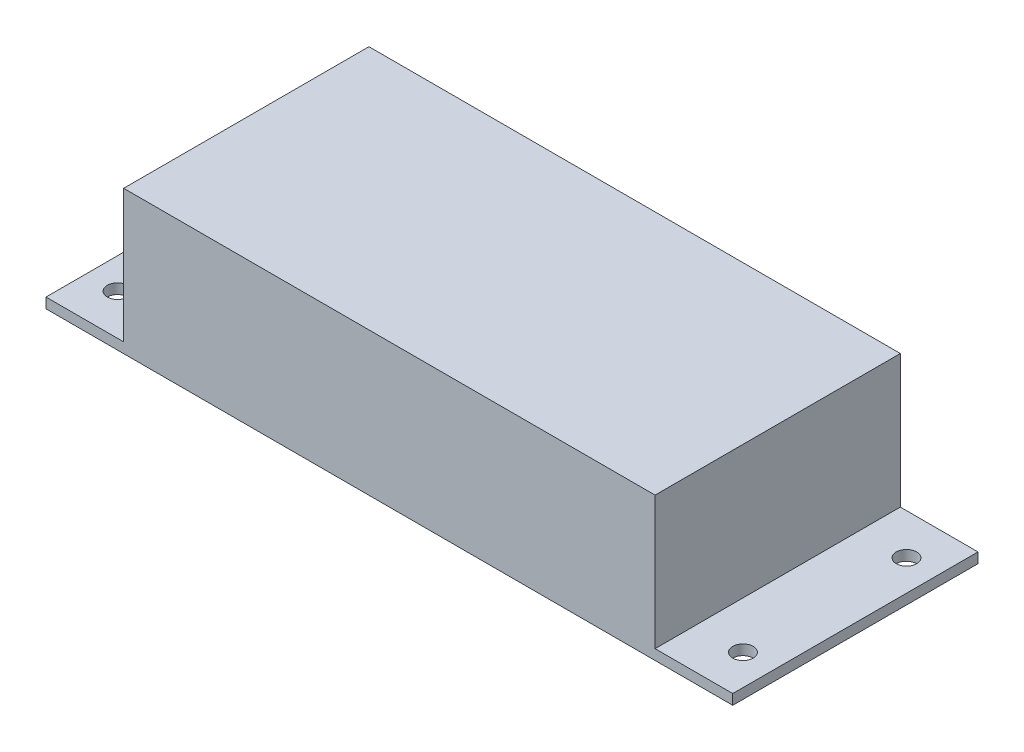
ISO-10303-21;
HEADER;
FILE_DESCRIPTION(('STEP AP214'),'2;1');
FILE_NAME('part.step','',(''),(''),'','','');
FILE_SCHEMA(('AUTOMOTIVE_DESIGN { 1 0 10303 214 1 1 1 1 }'));
ENDSEC;
DATA;
#1=APPLICATION_CONTEXT('core data for automotive mechanical design processes');
#2=APPLICATION_PROTOCOL_DEFINITION('international standard','automotive_design',2000,#1);
#3=PRODUCT_CONTEXT('',#1,'mechanical');
#4=PRODUCT('Part','Part','',(#3));
#5=PRODUCT_RELATED_PRODUCT_CATEGORY('part','',(#4));
#6=PRODUCT_DEFINITION_FORMATION('','',#4);
#7=PRODUCT_DEFINITION_CONTEXT('part definition',#1,'design');
#8=PRODUCT_DEFINITION('design','',#6,#7);
#9=PRODUCT_DEFINITION_SHAPE('','',#8);
#10=(LENGTH_UNIT() NAMED_UNIT(*) SI_UNIT(.MILLI.,.METRE.));
#11=(NAMED_UNIT(*) PLANE_ANGLE_UNIT() SI_UNIT($,.RADIAN.));
#12=(NAMED_UNIT(*) SI_UNIT($,.STERADIAN.) SOLID_ANGLE_UNIT());
#13=UNCERTAINTY_MEASURE_WITH_UNIT(LENGTH_MEASURE(1.E-05),#10,'distance_accuracy_value','');
#14=(GEOMETRIC_REPRESENTATION_CONTEXT(3) GLOBAL_UNCERTAINTY_ASSIGNED_CONTEXT((#13)) GLOBAL_UNIT_ASSIGNED_CONTEXT((#10,
#11,#12)) REPRESENTATION_CONTEXT('',''));
#15=CARTESIAN_POINT('',(0.,0.,0.));
#16=DIRECTION('',(0.,0.,1.));
#17=DIRECTION('',(1.,0.,0.));
#18=AXIS2_PLACEMENT_3D('',#15,#16,#17);
#19=CARTESIAN_POINT('',(41.275,22.2504,19.05));
#20=DIRECTION('',(-1.,0.,0.));
#21=DIRECTION('',(0.,0.,1.));
#22=AXIS2_PLACEMENT_3D('',#19,#20,#21);
#23=PLANE('',#22);
#24=DIRECTION('',(0.,-1.,0.));
#25=VECTOR('',#24,1.);
#26=CARTESIAN_POINT('',(41.275,22.2504,19.05));
#27=LINE('',#26,#25);
#28=CARTESIAN_POINT('',(41.275,22.2504,19.05));
#29=VERTEX_POINT('',#28);
#30=CARTESIAN_POINT('',(41.275,1.5875,19.05));
#31=VERTEX_POINT('',#30);
#32=EDGE_CURVE('E200',#29,#31,#27,.T.);
#33=ORIENTED_EDGE('',*,*,#32,.T.);
#34=DIRECTION('',(0.,0.,-1.));
#35=VECTOR('',#34,1.);
#36=CARTESIAN_POINT('',(41.275,1.5875,19.05));
#37=LINE('',#36,#35);
#38=CARTESIAN_POINT('',(41.275,1.5875,-19.05));
#39=VERTEX_POINT('',#38);
#40=EDGE_CURVE('E162',#31,#39,#37,.T.);
#41=ORIENTED_EDGE('',*,*,#40,.T.);
#42=DIRECTION('',(0.,-1.,0.));
#43=VECTOR('',#42,1.);
#44=CARTESIAN_POINT('',(41.275,22.2504,-19.05));
#45=LINE('',#44,#43);
#46=CARTESIAN_POINT('',(41.275,22.2504,-19.05));
#47=VERTEX_POINT('',#46);
#48=EDGE_CURVE('E12',#47,#39,#45,.T.);
#49=ORIENTED_EDGE('',*,*,#48,.F.);
#50=DIRECTION('',(0.,0.,-1.));
#51=VECTOR('',#50,1.);
#52=CARTESIAN_POINT('',(41.275,22.2504,19.05));
#53=LINE('',#52,#51);
#54=EDGE_CURVE('E191',#29,#47,#53,.T.);
#55=ORIENTED_EDGE('',*,*,#54,.F.);
#56=EDGE_LOOP('',(#33,#41,#49,#55));
#57=FACE_BOUND('',#56,.T.);
#58=ADVANCED_FACE('F93',(#57),#23,.F.);
#59=CARTESIAN_POINT('',(-41.275,22.2504,-19.05));
#60=DIRECTION('',(0.,0.,1.));
#61=DIRECTION('',(1.,0.,0.));
#62=AXIS2_PLACEMENT_3D('',#59,#60,#61);
#63=PLANE('',#62);
#64=ORIENTED_EDGE('',*,*,#48,.T.);
#65=DIRECTION('',(1.,0.,0.));
#66=VECTOR('',#65,1.);
#67=CARTESIAN_POINT('',(-53.34,1.5875,-19.05));
#68=LINE('',#67,#66);
#69=CARTESIAN_POINT('',(53.34,1.5875,-19.05));
#70=VERTEX_POINT('',#69);
#71=EDGE_CURVE('E177',#39,#70,#68,.T.);
#72=ORIENTED_EDGE('',*,*,#71,.T.);
#73=DIRECTION('',(0.,-1.,0.));
#74=VECTOR('',#73,1.);
#75=CARTESIAN_POINT('',(53.34,1.5875,-19.05));
#76=LINE('',#75,#74);
#77=CARTESIAN_POINT('',(53.34,0.,-19.05));
#78=VERTEX_POINT('',#77);
#79=EDGE_CURVE('E176',#70,#78,#76,.T.);
#80=ORIENTED_EDGE('',*,*,#79,.T.);
#81=DIRECTION('',(-1.,0.,0.));
#82=VECTOR('',#81,1.);
#83=CARTESIAN_POINT('',(-41.275,0.,-19.05));
#84=LINE('',#83,#82);
#85=CARTESIAN_POINT('',(-53.34,0.,-19.05));
#86=VERTEX_POINT('',#85);
#87=EDGE_CURVE('E190',#78,#86,#84,.T.);
#88=ORIENTED_EDGE('',*,*,#87,.T.);
#89=DIRECTION('',(0.,-1.,0.));
#90=VECTOR('',#89,1.);
#91=CARTESIAN_POINT('',(-53.34,1.5875,-19.05));
#92=LINE('',#91,#90);
#93=CARTESIAN_POINT('',(-53.34,1.5875,-19.05));
#94=VERTEX_POINT('',#93);
#95=EDGE_CURVE('E185',#94,#86,#92,.T.);
#96=ORIENTED_EDGE('',*,*,#95,.F.);
#97=CARTESIAN_POINT('',(-41.275,1.58750000000001,-19.05));
#98=VERTEX_POINT('',#97);
#99=EDGE_CURVE('E219',#94,#98,#68,.T.);
#100=ORIENTED_EDGE('',*,*,#99,.T.);
#101=DIRECTION('',(0.,-1.,0.));
#102=VECTOR('',#101,1.);
#103=CARTESIAN_POINT('',(-41.275,22.2504,-19.05));
#104=LINE('',#103,#102);
#105=CARTESIAN_POINT('',(-41.275,22.2504,-19.05));
#106=VERTEX_POINT('',#105);
#107=EDGE_CURVE('E100',#106,#98,#104,.T.);
#108=ORIENTED_EDGE('',*,*,#107,.F.);
#109=DIRECTION('',(-1.,0.,0.));
#110=VECTOR('',#109,1.);
#111=CARTESIAN_POINT('',(-41.275,22.2504,-19.05));
#112=LINE('',#111,#110);
#113=EDGE_CURVE('E194',#47,#106,#112,.T.);
#114=ORIENTED_EDGE('',*,*,#113,.F.);
#115=EDGE_LOOP('',(#64,#72,#80,#88,#96,#100,#108,#114));
#116=FACE_BOUND('',#115,.T.);
#117=ADVANCED_FACE('F236',(#116),#63,.F.);
#118=CARTESIAN_POINT('',(-41.275,22.2504,19.05));
#119=DIRECTION('',(1.,0.,0.));
#120=DIRECTION('',(0.,0.,-1.));
#121=AXIS2_PLACEMENT_3D('',#118,#119,#120);
#122=PLANE('',#121);
#123=ORIENTED_EDGE('',*,*,#107,.T.);
#124=DIRECTION('',(0.,0.,1.));
#125=VECTOR('',#124,1.);
#126=CARTESIAN_POINT('',(-41.275,1.5875,19.05));
#127=LINE('',#126,#125);
#128=CARTESIAN_POINT('',(-41.275,1.58750000000001,19.05));
#129=VERTEX_POINT('',#128);
#130=EDGE_CURVE('E110',#98,#129,#127,.T.);
#131=ORIENTED_EDGE('',*,*,#130,.T.);
#132=DIRECTION('',(0.,-1.,0.));
#133=VECTOR('',#132,1.);
#134=CARTESIAN_POINT('',(-41.275,22.2504,19.05));
#135=LINE('',#134,#133);
#136=CARTESIAN_POINT('',(-41.275,22.2504,19.05));
#137=VERTEX_POINT('',#136);
#138=EDGE_CURVE('E204',#137,#129,#135,.T.);
#139=ORIENTED_EDGE('',*,*,#138,.F.);
#140=DIRECTION('',(0.,0.,1.));
#141=VECTOR('',#140,1.);
#142=CARTESIAN_POINT('',(-41.275,22.2504,19.05));
#143=LINE('',#142,#141);
#144=EDGE_CURVE('E196',#106,#137,#143,.T.);
#145=ORIENTED_EDGE('',*,*,#144,.F.);
#146=EDGE_LOOP('',(#123,#131,#139,#145));
#147=FACE_BOUND('',#146,.T.);
#148=ADVANCED_FACE('F242',(#147),#122,.F.);
#149=CARTESIAN_POINT('',(-41.275,22.2504,19.05));
#150=DIRECTION('',(0.,0.,-1.));
#151=DIRECTION('',(-1.,0.,0.));
#152=AXIS2_PLACEMENT_3D('',#149,#150,#151);
#153=PLANE('',#152);
#154=ORIENTED_EDGE('',*,*,#138,.T.);
#155=DIRECTION('',(1.,0.,0.));
#156=VECTOR('',#155,1.);
#157=CARTESIAN_POINT('',(-53.34,1.5875,19.05));
#158=LINE('',#157,#156);
#159=CARTESIAN_POINT('',(-53.34,1.5875,19.05));
#160=VERTEX_POINT('',#159);
#161=EDGE_CURVE('E167',#160,#129,#158,.T.);
#162=ORIENTED_EDGE('',*,*,#161,.F.);
#163=DIRECTION('',(0.,-1.,0.));
#164=VECTOR('',#163,1.);
#165=CARTESIAN_POINT('',(-53.34,1.5875,19.05));
#166=LINE('',#165,#164);
#167=CARTESIAN_POINT('',(-53.34,0.,19.05));
#168=VERTEX_POINT('',#167);
#169=EDGE_CURVE('E222',#160,#168,#166,.T.);
#170=ORIENTED_EDGE('',*,*,#169,.T.);
#171=DIRECTION('',(1.,0.,0.));
#172=VECTOR('',#171,1.);
#173=CARTESIAN_POINT('',(-41.275,0.,19.05));
#174=LINE('',#173,#172);
#175=CARTESIAN_POINT('',(53.34,0.,19.05));
#176=VERTEX_POINT('',#175);
#177=EDGE_CURVE('E181',#168,#176,#174,.T.);
#178=ORIENTED_EDGE('',*,*,#177,.T.);
#179=DIRECTION('',(0.,-1.,0.));
#180=VECTOR('',#179,1.);
#181=CARTESIAN_POINT('',(53.34,1.5875,19.05));
#182=LINE('',#181,#180);
#183=CARTESIAN_POINT('',(53.34,1.5875,19.05));
#184=VERTEX_POINT('',#183);
#185=EDGE_CURVE('E174',#184,#176,#182,.T.);
#186=ORIENTED_EDGE('',*,*,#185,.F.);
#187=EDGE_CURVE('E156',#31,#184,#158,.T.);
#188=ORIENTED_EDGE('',*,*,#187,.F.);
#189=ORIENTED_EDGE('',*,*,#32,.F.);
#190=DIRECTION('',(1.,0.,0.));
#191=VECTOR('',#190,1.);
#192=CARTESIAN_POINT('',(-41.275,22.2504,19.05));
#193=LINE('',#192,#191);
#194=EDGE_CURVE('E198',#137,#29,#193,.T.);
#195=ORIENTED_EDGE('',*,*,#194,.F.);
#196=EDGE_LOOP('',(#154,#162,#170,#178,#186,#188,#189,#195));
#197=FACE_BOUND('',#196,.T.);
#198=ADVANCED_FACE('F179',(#197),#153,.F.);
#199=CARTESIAN_POINT('',(0.,22.2504,0.));
#200=DIRECTION('',(0.,-1.,0.));
#201=DIRECTION('',(0.,0.,-1.));
#202=AXIS2_PLACEMENT_3D('',#199,#200,#201);
#203=PLANE('',#202);
#204=ORIENTED_EDGE('',*,*,#54,.T.);
#205=ORIENTED_EDGE('',*,*,#113,.T.);
#206=ORIENTED_EDGE('',*,*,#144,.T.);
#207=ORIENTED_EDGE('',*,*,#194,.T.);
#208=EDGE_LOOP('',(#204,#205,#206,#207));
#209=FACE_BOUND('',#208,.T.);
#210=ADVANCED_FACE('F241',(#209),#203,.F.);
#211=CARTESIAN_POINT('',(0.,0.,0.));
#212=DIRECTION('',(0.,-1.,0.));
#213=DIRECTION('',(0.,0.,-1.));
#214=AXIS2_PLACEMENT_3D('',#211,#212,#213);
#215=PLANE('',#214);
#216=ORIENTED_EDGE('',*,*,#87,.F.);
#217=DIRECTION('',(0.,0.,-1.));
#218=VECTOR('',#217,1.);
#219=CARTESIAN_POINT('',(53.34,0.,19.05));
#220=LINE('',#219,#218);
#221=EDGE_CURVE('E223',#176,#78,#220,.T.);
#222=ORIENTED_EDGE('',*,*,#221,.F.);
#223=ORIENTED_EDGE('',*,*,#177,.F.);
#224=DIRECTION('',(0.,0.,-1.));
#225=VECTOR('',#224,1.);
#226=CARTESIAN_POINT('',(-53.34,0.,19.05));
#227=LINE('',#226,#225);
#228=EDGE_CURVE('E168',#168,#86,#227,.T.);
#229=ORIENTED_EDGE('',*,*,#228,.T.);
#230=EDGE_LOOP('',(#216,#222,#223,#229));
#231=FACE_BOUND('',#230,.T.);
#232=CARTESIAN_POINT('',(-48.5775,0.,-12.7));
#233=DIRECTION('',(0.,1.,0.));
#234=DIRECTION('',(0.,0.,1.));
#235=AXIS2_PLACEMENT_3D('',#232,#233,#234);
#236=CIRCLE('',#235,1.5875);
#237=CARTESIAN_POINT('',(-48.5775,0.,-11.1125));
#238=VERTEX_POINT('',#237);
#239=EDGE_CURVE('E380',#238,#238,#236,.T.);
#240=ORIENTED_EDGE('',*,*,#239,.T.);
#241=EDGE_LOOP('',(#240));
#242=FACE_BOUND('',#241,.T.);
#243=CARTESIAN_POINT('',(-48.5775,0.,12.7));
#244=DIRECTION('',(0.,-1.,0.));
#245=DIRECTION('',(0.,0.,-1.));
#246=AXIS2_PLACEMENT_3D('',#243,#244,#245);
#247=CIRCLE('',#246,1.5875);
#248=CARTESIAN_POINT('',(-48.5775,0.,11.1125));
#249=VERTEX_POINT('',#248);
#250=EDGE_CURVE('E216',#249,#249,#247,.T.);
#251=ORIENTED_EDGE('',*,*,#250,.F.);
#252=EDGE_LOOP('',(#251));
#253=FACE_BOUND('',#252,.T.);
#254=CARTESIAN_POINT('',(48.5775,0.,-12.7));
#255=DIRECTION('',(0.,-1.,0.));
#256=DIRECTION('',(0.,0.,-1.));
#257=AXIS2_PLACEMENT_3D('',#254,#255,#256);
#258=CIRCLE('',#257,1.5875);
#259=CARTESIAN_POINT('',(48.5775,0.,-14.2875));
#260=VERTEX_POINT('',#259);
#261=EDGE_CURVE('E377',#260,#260,#258,.T.);
#262=ORIENTED_EDGE('',*,*,#261,.F.);
#263=EDGE_LOOP('',(#262));
#264=FACE_BOUND('',#263,.T.);
#265=CARTESIAN_POINT('',(48.5775,0.,12.7));
#266=DIRECTION('',(0.,1.,0.));
#267=DIRECTION('',(0.,0.,1.));
#268=AXIS2_PLACEMENT_3D('',#265,#266,#267);
#269=CIRCLE('',#268,1.5875);
#270=CARTESIAN_POINT('',(48.5775,0.,14.2875));
#271=VERTEX_POINT('',#270);
#272=EDGE_CURVE('E373',#271,#271,#269,.T.);
#273=ORIENTED_EDGE('',*,*,#272,.T.);
#274=EDGE_LOOP('',(#273));
#275=FACE_BOUND('',#274,.T.);
#276=ADVANCED_FACE('F234',(#231,#242,#253,#264,#275),#215,.T.);
#277=CARTESIAN_POINT('',(-48.5775,1.5875,12.7));
#278=DIRECTION('',(0.,-1.,0.));
#279=DIRECTION('',(0.,0.,-1.));
#280=AXIS2_PLACEMENT_3D('',#277,#278,#279);
#281=CYLINDRICAL_SURFACE('',#280,1.5875);
#282=CARTESIAN_POINT('',(-48.5775,1.5875,12.7));
#283=DIRECTION('',(0.,-1.,0.));
#284=DIRECTION('',(0.,0.,-1.));
#285=AXIS2_PLACEMENT_3D('',#282,#283,#284);
#286=CIRCLE('',#285,1.5875);
#287=CARTESIAN_POINT('',(-48.5775,1.5875,11.1125));
#288=VERTEX_POINT('',#287);
#289=EDGE_CURVE('E225',#288,#288,#286,.T.);
#290=ORIENTED_EDGE('',*,*,#289,.F.);
#291=EDGE_LOOP('',(#290));
#292=FACE_BOUND('',#291,.T.);
#293=ORIENTED_EDGE('',*,*,#250,.T.);
#294=EDGE_LOOP('',(#293));
#295=FACE_BOUND('',#294,.T.);
#296=ADVANCED_FACE('F281',(#292,#295),#281,.F.);
#297=CARTESIAN_POINT('',(-48.5775,1.5875,-12.7));
#298=DIRECTION('',(0.,-1.,0.));
#299=DIRECTION('',(0.,0.,-1.));
#300=AXIS2_PLACEMENT_3D('',#297,#298,#299);
#301=CYLINDRICAL_SURFACE('',#300,1.5875);
#302=CARTESIAN_POINT('',(-48.5775,1.5875,-12.7));
#303=DIRECTION('',(0.,1.,0.));
#304=DIRECTION('',(0.,0.,1.));
#305=AXIS2_PLACEMENT_3D('',#302,#303,#304);
#306=CIRCLE('',#305,1.5875);
#307=CARTESIAN_POINT('',(-48.5775,1.5875,-11.1125));
#308=VERTEX_POINT('',#307);
#309=EDGE_CURVE('E375',#308,#308,#306,.T.);
#310=ORIENTED_EDGE('',*,*,#309,.T.);
#311=EDGE_LOOP('',(#310));
#312=FACE_BOUND('',#311,.T.);
#313=ORIENTED_EDGE('',*,*,#239,.F.);
#314=EDGE_LOOP('',(#313));
#315=FACE_BOUND('',#314,.T.);
#316=ADVANCED_FACE('F290',(#312,#315),#301,.F.);
#317=CARTESIAN_POINT('',(-53.34,1.5875,19.05));
#318=DIRECTION('',(-1.,0.,0.));
#319=DIRECTION('',(0.,0.,1.));
#320=AXIS2_PLACEMENT_3D('',#317,#318,#319);
#321=PLANE('',#320);
#322=ORIENTED_EDGE('',*,*,#228,.F.);
#323=ORIENTED_EDGE('',*,*,#169,.F.);
#324=DIRECTION('',(0.,0.,-1.));
#325=VECTOR('',#324,1.);
#326=CARTESIAN_POINT('',(-53.34,1.5875,19.05));
#327=LINE('',#326,#325);
#328=EDGE_CURVE('E214',#160,#94,#327,.T.);
#329=ORIENTED_EDGE('',*,*,#328,.T.);
#330=ORIENTED_EDGE('',*,*,#95,.T.);
#331=EDGE_LOOP('',(#322,#323,#329,#330));
#332=FACE_BOUND('',#331,.T.);
#333=ADVANCED_FACE('F231',(#332),#321,.T.);
#334=CARTESIAN_POINT('',(0.,1.5875,0.));
#335=DIRECTION('',(0.,1.,0.));
#336=DIRECTION('',(0.,0.,1.));
#337=AXIS2_PLACEMENT_3D('',#334,#335,#336);
#338=PLANE('',#337);
#339=ORIENTED_EDGE('',*,*,#309,.F.);
#340=EDGE_LOOP('',(#339));
#341=FACE_BOUND('',#340,.T.);
#342=ORIENTED_EDGE('',*,*,#289,.T.);
#343=EDGE_LOOP('',(#342));
#344=FACE_BOUND('',#343,.T.);
#345=ORIENTED_EDGE('',*,*,#130,.F.);
#346=ORIENTED_EDGE('',*,*,#99,.F.);
#347=ORIENTED_EDGE('',*,*,#328,.F.);
#348=ORIENTED_EDGE('',*,*,#161,.T.);
#349=EDGE_LOOP('',(#345,#346,#347,#348));
#350=FACE_BOUND('',#349,.T.);
#351=ADVANCED_FACE('F210',(#341,#344,#350),#338,.T.);
#352=CARTESIAN_POINT('',(48.5775,1.5875,-12.7));
#353=DIRECTION('',(0.,-1.,0.));
#354=DIRECTION('',(0.,0.,-1.));
#355=AXIS2_PLACEMENT_3D('',#352,#353,#354);
#356=CIRCLE('',#355,1.5875);
#357=CARTESIAN_POINT('',(48.5775,1.5875,-14.2875));
#358=VERTEX_POINT('',#357);
#359=EDGE_CURVE('E384',#358,#358,#356,.T.);
#360=ORIENTED_EDGE('',*,*,#359,.T.);
#361=EDGE_LOOP('',(#360));
#362=FACE_BOUND('',#361,.T.);
#363=CARTESIAN_POINT('',(48.5775,1.5875,12.7));
#364=DIRECTION('',(0.,1.,0.));
#365=DIRECTION('',(0.,0.,1.));
#366=AXIS2_PLACEMENT_3D('',#363,#364,#365);
#367=CIRCLE('',#366,1.5875);
#368=CARTESIAN_POINT('',(48.5775,1.5875,14.2875));
#369=VERTEX_POINT('',#368);
#370=EDGE_CURVE('E370',#369,#369,#367,.T.);
#371=ORIENTED_EDGE('',*,*,#370,.F.);
#372=EDGE_LOOP('',(#371));
#373=FACE_BOUND('',#372,.T.);
#374=ORIENTED_EDGE('',*,*,#40,.F.);
#375=ORIENTED_EDGE('',*,*,#187,.T.);
#376=DIRECTION('',(0.,0.,-1.));
#377=VECTOR('',#376,1.);
#378=CARTESIAN_POINT('',(53.34,1.5875,19.05));
#379=LINE('',#378,#377);
#380=EDGE_CURVE('E159',#184,#70,#379,.T.);
#381=ORIENTED_EDGE('',*,*,#380,.T.);
#382=ORIENTED_EDGE('',*,*,#71,.F.);
#383=EDGE_LOOP('',(#374,#375,#381,#382));
#384=FACE_BOUND('',#383,.T.);
#385=ADVANCED_FACE('F158',(#362,#373,#384),#338,.T.);
#386=CARTESIAN_POINT('',(53.34,1.5875,19.05));
#387=DIRECTION('',(-1.,0.,0.));
#388=DIRECTION('',(0.,0.,1.));
#389=AXIS2_PLACEMENT_3D('',#386,#387,#388);
#390=PLANE('',#389);
#391=ORIENTED_EDGE('',*,*,#221,.T.);
#392=ORIENTED_EDGE('',*,*,#79,.F.);
#393=ORIENTED_EDGE('',*,*,#380,.F.);
#394=ORIENTED_EDGE('',*,*,#185,.T.);
#395=EDGE_LOOP('',(#391,#392,#393,#394));
#396=FACE_BOUND('',#395,.T.);
#397=ADVANCED_FACE('F173',(#396),#390,.F.);
#398=CARTESIAN_POINT('',(48.5775,1.5875,-12.7));
#399=DIRECTION('',(0.,-1.,0.));
#400=DIRECTION('',(0.,0.,-1.));
#401=AXIS2_PLACEMENT_3D('',#398,#399,#400);
#402=CYLINDRICAL_SURFACE('',#401,1.5875);
#403=ORIENTED_EDGE('',*,*,#359,.F.);
#404=EDGE_LOOP('',(#403));
#405=FACE_BOUND('',#404,.T.);
#406=ORIENTED_EDGE('',*,*,#261,.T.);
#407=EDGE_LOOP('',(#406));
#408=FACE_BOUND('',#407,.T.);
#409=ADVANCED_FACE('F334',(#405,#408),#402,.F.);
#410=CARTESIAN_POINT('',(48.5775,1.5875,12.7));
#411=DIRECTION('',(0.,-1.,0.));
#412=DIRECTION('',(0.,0.,-1.));
#413=AXIS2_PLACEMENT_3D('',#410,#411,#412);
#414=CYLINDRICAL_SURFACE('',#413,1.5875);
#415=ORIENTED_EDGE('',*,*,#370,.T.);
#416=EDGE_LOOP('',(#415));
#417=FACE_BOUND('',#416,.T.);
#418=ORIENTED_EDGE('',*,*,#272,.F.);
#419=EDGE_LOOP('',(#418));
#420=FACE_BOUND('',#419,.T.);
#421=ADVANCED_FACE('F343',(#417,#420),#414,.F.);
#422=CLOSED_SHELL('',(#58,#117,#148,#198,#210,#276,#296,#316,#333,#351,#385,#397,#409,#421));
#423=MANIFOLD_SOLID_BREP('B2',#422);
#424=ADVANCED_BREP_SHAPE_REPRESENTATION('',(#18,#423),#14);
#425=SHAPE_DEFINITION_REPRESENTATION(#9,#424);
ENDSEC;
END-ISO-10303-21;
